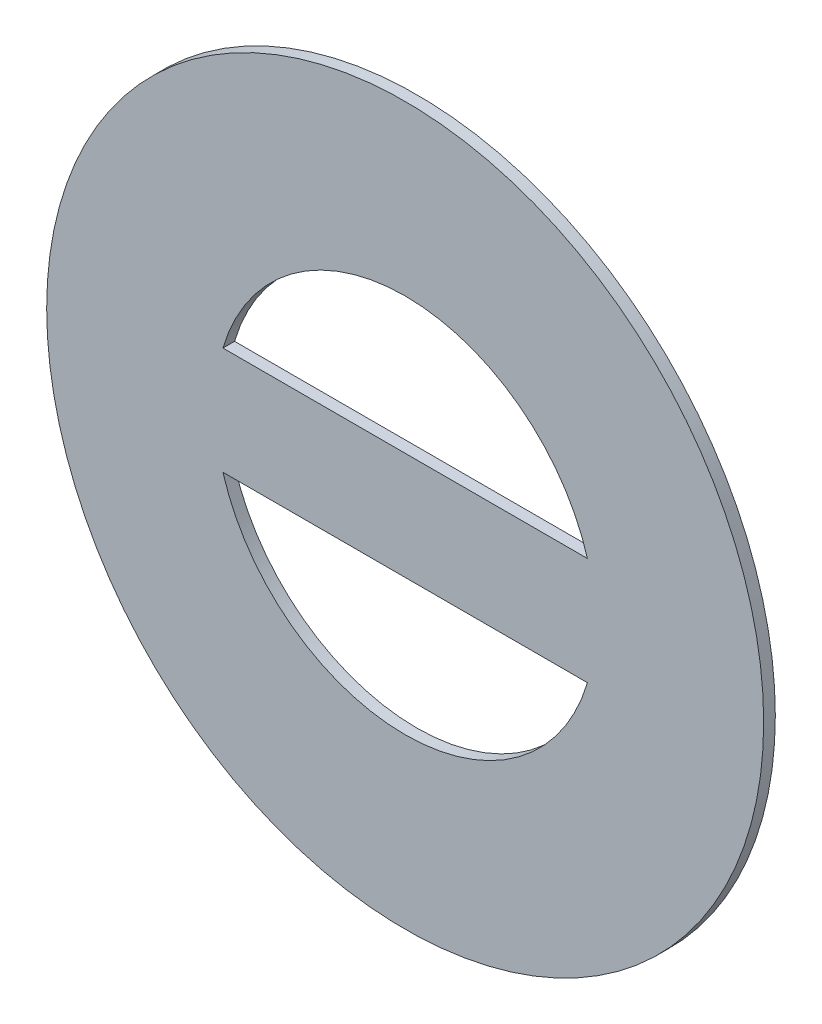
ISO-10303-21;
HEADER;
FILE_DESCRIPTION(('STEP AP214'),'2;1');
FILE_NAME('part.step','',(''),(''),'','','');
FILE_SCHEMA(('AUTOMOTIVE_DESIGN { 1 0 10303 214 1 1 1 1 }'));
ENDSEC;
DATA;
#1=APPLICATION_CONTEXT('core data for automotive mechanical design processes');
#2=APPLICATION_PROTOCOL_DEFINITION('international standard','automotive_design',2000,#1);
#3=PRODUCT_CONTEXT('',#1,'mechanical');
#4=PRODUCT('Part','Part','',(#3));
#5=PRODUCT_RELATED_PRODUCT_CATEGORY('part','',(#4));
#6=PRODUCT_DEFINITION_FORMATION('','',#4);
#7=PRODUCT_DEFINITION_CONTEXT('part definition',#1,'design');
#8=PRODUCT_DEFINITION('design','',#6,#7);
#9=PRODUCT_DEFINITION_SHAPE('','',#8);
#10=(LENGTH_UNIT() NAMED_UNIT(*) SI_UNIT(.MILLI.,.METRE.));
#11=(NAMED_UNIT(*) PLANE_ANGLE_UNIT() SI_UNIT($,.RADIAN.));
#12=(NAMED_UNIT(*) SI_UNIT($,.STERADIAN.) SOLID_ANGLE_UNIT());
#13=UNCERTAINTY_MEASURE_WITH_UNIT(LENGTH_MEASURE(1.E-05),#10,'distance_accuracy_value','');
#14=(GEOMETRIC_REPRESENTATION_CONTEXT(3) GLOBAL_UNCERTAINTY_ASSIGNED_CONTEXT((#13)) GLOBAL_UNIT_ASSIGNED_CONTEXT((#10,
#11,#12)) REPRESENTATION_CONTEXT('',''));
#15=CARTESIAN_POINT('',(0.,0.,0.));
#16=DIRECTION('',(0.,0.,1.));
#17=DIRECTION('',(1.,0.,0.));
#18=AXIS2_PLACEMENT_3D('',#15,#16,#17);
#19=CARTESIAN_POINT('',(4.87072486134823,-16.6967588105672,3.25));
#20=DIRECTION('',(0.,1.,0.));
#21=DIRECTION('',(0.,0.,1.));
#22=AXIS2_PLACEMENT_3D('',#19,#20,#21);
#23=PLANE('',#22);
#24=DIRECTION('',(1.,0.,0.));
#25=VECTOR('',#24,1.);
#26=CARTESIAN_POINT('',(4.87072486134823,-16.6967588105672,0.));
#27=LINE('',#26,#25);
#28=CARTESIAN_POINT('',(-45.9623352472071,-16.6967588105672,0.));
#29=VERTEX_POINT('',#28);
#30=CARTESIAN_POINT('',(55.7037849699036,-16.6967588105672,0.));
#31=VERTEX_POINT('',#30);
#32=EDGE_CURVE('E109',#29,#31,#27,.T.);
#33=ORIENTED_EDGE('',*,*,#32,.T.);
#34=DIRECTION('',(0.,0.,-1.));
#35=VECTOR('',#34,1.);
#36=CARTESIAN_POINT('',(55.7037849699036,-16.6967588105672,3.25));
#37=LINE('',#36,#35);
#38=CARTESIAN_POINT('',(55.7037849699036,-16.6967588105672,3.25));
#39=VERTEX_POINT('',#38);
#40=EDGE_CURVE('E11',#39,#31,#37,.T.);
#41=ORIENTED_EDGE('',*,*,#40,.F.);
#42=DIRECTION('',(1.,0.,0.));
#43=VECTOR('',#42,1.);
#44=CARTESIAN_POINT('',(4.87072486134823,-16.6967588105672,3.25));
#45=LINE('',#44,#43);
#46=CARTESIAN_POINT('',(-45.9623352472071,-16.6967588105672,3.25));
#47=VERTEX_POINT('',#46);
#48=EDGE_CURVE('E98',#47,#39,#45,.T.);
#49=ORIENTED_EDGE('',*,*,#48,.F.);
#50=DIRECTION('',(0.,0.,-1.));
#51=VECTOR('',#50,1.);
#52=CARTESIAN_POINT('',(-45.9623352472071,-16.6967588105672,3.25));
#53=LINE('',#52,#51);
#54=EDGE_CURVE('E45',#47,#29,#53,.T.);
#55=ORIENTED_EDGE('',*,*,#54,.T.);
#56=EDGE_LOOP('',(#33,#41,#49,#55));
#57=FACE_BOUND('',#56,.T.);
#58=ADVANCED_FACE('F35',(#57),#23,.F.);
#59=CARTESIAN_POINT('',(4.87072486134821,-1.69675881056719,3.25));
#60=DIRECTION('',(0.,0.,-1.));
#61=DIRECTION('',(-1.,0.,0.));
#62=AXIS2_PLACEMENT_3D('',#59,#60,#61);
#63=CYLINDRICAL_SURFACE('',#62,53.);
#64=CARTESIAN_POINT('',(4.87072486134821,-1.69675881056719,0.));
#65=DIRECTION('',(0.,0.,1.));
#66=DIRECTION('',(1.,0.,0.));
#67=AXIS2_PLACEMENT_3D('',#64,#65,#66);
#68=CIRCLE('',#67,53.);
#69=CARTESIAN_POINT('',(55.7037849699036,13.3032411894328,0.));
#70=VERTEX_POINT('',#69);
#71=CARTESIAN_POINT('',(-45.9623352472071,13.3032411894328,0.));
#72=VERTEX_POINT('',#71);
#73=EDGE_CURVE('E103',#70,#72,#68,.T.);
#74=ORIENTED_EDGE('',*,*,#73,.F.);
#75=DIRECTION('',(0.,0.,-1.));
#76=VECTOR('',#75,1.);
#77=CARTESIAN_POINT('',(55.7037849699036,13.3032411894328,3.25));
#78=LINE('',#77,#76);
#79=CARTESIAN_POINT('',(55.7037849699036,13.3032411894328,3.25));
#80=VERTEX_POINT('',#79);
#81=EDGE_CURVE('E39',#80,#70,#78,.T.);
#82=ORIENTED_EDGE('',*,*,#81,.F.);
#83=CARTESIAN_POINT('',(4.87072486134821,-1.69675881056719,3.25));
#84=DIRECTION('',(0.,0.,1.));
#85=DIRECTION('',(1.,0.,0.));
#86=AXIS2_PLACEMENT_3D('',#83,#84,#85);
#87=CIRCLE('',#86,53.);
#88=CARTESIAN_POINT('',(-45.9623352472071,13.3032411894328,3.25));
#89=VERTEX_POINT('',#88);
#90=EDGE_CURVE('E89',#80,#89,#87,.T.);
#91=ORIENTED_EDGE('',*,*,#90,.T.);
#92=DIRECTION('',(0.,0.,-1.));
#93=VECTOR('',#92,1.);
#94=CARTESIAN_POINT('',(-45.9623352472071,13.3032411894328,3.25));
#95=LINE('',#94,#93);
#96=EDGE_CURVE('E81',#89,#72,#95,.T.);
#97=ORIENTED_EDGE('',*,*,#96,.T.);
#98=EDGE_LOOP('',(#74,#82,#91,#97));
#99=FACE_BOUND('',#98,.T.);
#100=ADVANCED_FACE('F37',(#99),#63,.F.);
#101=CARTESIAN_POINT('',(4.87072486134821,-1.69675881056719,3.25));
#102=DIRECTION('',(0.,0.,-1.));
#103=DIRECTION('',(-1.,0.,0.));
#104=AXIS2_PLACEMENT_3D('',#101,#102,#103);
#105=CYLINDRICAL_SURFACE('',#104,100.);
#106=CARTESIAN_POINT('',(4.87072486134821,-1.69675881056719,3.25));
#107=DIRECTION('',(0.,0.,1.));
#108=DIRECTION('',(1.,0.,0.));
#109=AXIS2_PLACEMENT_3D('',#106,#107,#108);
#110=CIRCLE('',#109,100.);
#111=CARTESIAN_POINT('',(-95.1292751386518,-1.69675881056719,3.25));
#112=VERTEX_POINT('',#111);
#113=EDGE_CURVE('E95',#112,#112,#110,.T.);
#114=CARTESIAN_POINT('',(4.87072486134821,-1.69675881056719,0.));
#115=DIRECTION('',(0.,0.,1.));
#116=DIRECTION('',(1.,0.,0.));
#117=AXIS2_PLACEMENT_3D('',#114,#115,#116);
#118=CIRCLE('',#117,100.);
#119=CARTESIAN_POINT('',(-95.1292751386518,-1.69675881056719,0.));
#120=VERTEX_POINT('',#119);
#121=EDGE_CURVE('E106',#120,#120,#118,.T.);
#122=CARTESIAN_POINT('',(-95.1292751386518,-1.69675881056719,3.25));
#123=CARTESIAN_POINT('',(-95.1292751386518,-1.69675881056719,3.21614583333333));
#124=CARTESIAN_POINT('',(-95.1292751386518,-1.69675881056719,3.18229166666667));
#125=CARTESIAN_POINT('',(-95.1292751386518,-1.69675881056719,3.11458333333333));
#126=CARTESIAN_POINT('',(-95.1292751386518,-1.69675881056719,3.08072916666667));
#127=CARTESIAN_POINT('',(-95.1292751386518,-1.69675881056719,3.01302083333333));
#128=CARTESIAN_POINT('',(-95.1292751386518,-1.69675881056719,2.97916666666667));
#129=CARTESIAN_POINT('',(-95.1292751386518,-1.69675881056719,2.91145833333333));
#130=CARTESIAN_POINT('',(-95.1292751386518,-1.69675881056719,2.87760416666667));
#131=CARTESIAN_POINT('',(-95.1292751386518,-1.69675881056719,2.80989583333333));
#132=CARTESIAN_POINT('',(-95.1292751386518,-1.69675881056719,2.77604166666667));
#133=CARTESIAN_POINT('',(-95.1292751386518,-1.69675881056719,2.70833333333333));
#134=CARTESIAN_POINT('',(-95.1292751386518,-1.69675881056719,2.67447916666667));
#135=CARTESIAN_POINT('',(-95.1292751386518,-1.69675881056719,2.60677083333333));
#136=CARTESIAN_POINT('',(-95.1292751386518,-1.69675881056719,2.57291666666667));
#137=CARTESIAN_POINT('',(-95.1292751386518,-1.69675881056719,2.50520833333333));
#138=CARTESIAN_POINT('',(-95.1292751386518,-1.69675881056719,2.47135416666667));
#139=CARTESIAN_POINT('',(-95.1292751386518,-1.69675881056719,2.40364583333333));
#140=CARTESIAN_POINT('',(-95.1292751386518,-1.69675881056719,2.36979166666667));
#141=CARTESIAN_POINT('',(-95.1292751386518,-1.69675881056719,2.30208333333333));
#142=CARTESIAN_POINT('',(-95.1292751386518,-1.69675881056719,2.26822916666667));
#143=CARTESIAN_POINT('',(-95.1292751386518,-1.69675881056719,2.20052083333333));
#144=CARTESIAN_POINT('',(-95.1292751386518,-1.69675881056719,2.16666666666667));
#145=CARTESIAN_POINT('',(-95.1292751386518,-1.69675881056719,2.09895833333333));
#146=CARTESIAN_POINT('',(-95.1292751386518,-1.69675881056719,2.06510416666667));
#147=CARTESIAN_POINT('',(-95.1292751386518,-1.69675881056719,1.99739583333333));
#148=CARTESIAN_POINT('',(-95.1292751386518,-1.69675881056719,1.96354166666667));
#149=CARTESIAN_POINT('',(-95.1292751386518,-1.69675881056719,1.89583333333333));
#150=CARTESIAN_POINT('',(-95.1292751386518,-1.69675881056719,1.86197916666667));
#151=CARTESIAN_POINT('',(-95.1292751386518,-1.69675881056719,1.79427083333333));
#152=CARTESIAN_POINT('',(-95.1292751386518,-1.69675881056719,1.76041666666667));
#153=CARTESIAN_POINT('',(-95.1292751386518,-1.69675881056719,1.69270833333333));
#154=CARTESIAN_POINT('',(-95.1292751386518,-1.69675881056719,1.65885416666667));
#155=CARTESIAN_POINT('',(-95.1292751386518,-1.69675881056719,1.59114583333333));
#156=CARTESIAN_POINT('',(-95.1292751386518,-1.69675881056719,1.55729166666667));
#157=CARTESIAN_POINT('',(-95.1292751386518,-1.69675881056719,1.48958333333333));
#158=CARTESIAN_POINT('',(-95.1292751386518,-1.69675881056719,1.45572916666667));
#159=CARTESIAN_POINT('',(-95.1292751386518,-1.69675881056719,1.38802083333333));
#160=CARTESIAN_POINT('',(-95.1292751386518,-1.69675881056719,1.35416666666667));
#161=CARTESIAN_POINT('',(-95.1292751386518,-1.69675881056719,1.28645833333333));
#162=CARTESIAN_POINT('',(-95.1292751386518,-1.69675881056719,1.25260416666667));
#163=CARTESIAN_POINT('',(-95.1292751386518,-1.69675881056719,1.18489583333333));
#164=CARTESIAN_POINT('',(-95.1292751386518,-1.69675881056719,1.15104166666667));
#165=CARTESIAN_POINT('',(-95.1292751386518,-1.69675881056719,1.08333333333333));
#166=CARTESIAN_POINT('',(-95.1292751386518,-1.69675881056719,1.04947916666667));
#167=CARTESIAN_POINT('',(-95.1292751386518,-1.69675881056719,0.981770833333333));
#168=CARTESIAN_POINT('',(-95.1292751386518,-1.69675881056719,0.947916666666667));
#169=CARTESIAN_POINT('',(-95.1292751386518,-1.69675881056719,0.880208333333333));
#170=CARTESIAN_POINT('',(-95.1292751386518,-1.69675881056719,0.846354166666667));
#171=CARTESIAN_POINT('',(-95.1292751386518,-1.69675881056719,0.778645833333333));
#172=CARTESIAN_POINT('',(-95.1292751386518,-1.69675881056719,0.744791666666667));
#173=CARTESIAN_POINT('',(-95.1292751386518,-1.69675881056719,0.677083333333333));
#174=CARTESIAN_POINT('',(-95.1292751386518,-1.69675881056719,0.643229166666667));
#175=CARTESIAN_POINT('',(-95.1292751386518,-1.69675881056719,0.575520833333333));
#176=CARTESIAN_POINT('',(-95.1292751386518,-1.69675881056719,0.541666666666667));
#177=CARTESIAN_POINT('',(-95.1292751386518,-1.69675881056719,0.473958333333333));
#178=CARTESIAN_POINT('',(-95.1292751386518,-1.69675881056719,0.440104166666667));
#179=CARTESIAN_POINT('',(-95.1292751386518,-1.69675881056719,0.372395833333333));
#180=CARTESIAN_POINT('',(-95.1292751386518,-1.69675881056719,0.338541666666667));
#181=CARTESIAN_POINT('',(-95.1292751386518,-1.69675881056719,0.270833333333333));
#182=CARTESIAN_POINT('',(-95.1292751386518,-1.69675881056719,0.236979166666667));
#183=CARTESIAN_POINT('',(-95.1292751386518,-1.69675881056719,0.169270833333333));
#184=CARTESIAN_POINT('',(-95.1292751386518,-1.69675881056719,0.135416666666667));
#185=CARTESIAN_POINT('',(-95.1292751386518,-1.69675881056719,0.0677083333333334));
#186=CARTESIAN_POINT('',(-95.1292751386518,-1.69675881056719,0.0338541666666667));
#187=CARTESIAN_POINT('',(-95.1292751386518,-1.69675881056719,0.));
#188=B_SPLINE_CURVE_WITH_KNOTS('',3,(#122,#123,#124,#125,#126,#127,#128,#129,#130,#131,#132,
#133,#134,#135,#136,#137,#138,#139,#140,#141,#142,#143,#144,#145,#146,#147,#148,#149,#150,#151,
#152,#153,#154,#155,#156,#157,#158,#159,#160,#161,#162,#163,#164,#165,#166,#167,#168,#169,#170,
#171,#172,#173,#174,#175,#176,#177,#178,#179,#180,#181,#182,#183,#184,#185,#186,#187),
.UNSPECIFIED.,.F.,.F.,(4,2,2,2,2,2,2,2,2,2,2,2,2,2,2,2,2,2,2,2,2,2,2,2,2,2,2,2,2,2,2,2,4),(0.,
0.1015625,0.203125,0.3046875,0.40625,0.5078125,0.609375,0.7109375,0.8125,0.9140625,1.015625,
1.1171875,1.21875,1.3203125,1.421875,1.5234375,1.625,1.7265625,1.828125,1.9296875,2.03125,
2.1328125,2.234375,2.3359375,2.4375,2.5390625,2.640625,2.7421875,2.84375,2.9453125,3.046875,
3.1484375,3.25),.UNSPECIFIED.);
#189=EDGE_CURVE('BSEAM128',#112,#120,#188,.T.);
#190=ORIENTED_EDGE('',*,*,#113,.F.);
#191=ORIENTED_EDGE('',*,*,#121,.T.);
#192=ORIENTED_EDGE('',*,*,#189,.T.);
#193=ORIENTED_EDGE('',*,*,#189,.F.);
#194=EDGE_LOOP('',(#190,#192,#191,#193));
#195=FACE_BOUND('',#194,.T.);
#196=ADVANCED_FACE('F128',(#195),#105,.T.);
#197=CARTESIAN_POINT('',(4.87072486134823,13.3032411894328,3.25));
#198=DIRECTION('',(0.,1.,0.));
#199=DIRECTION('',(0.,0.,1.));
#200=AXIS2_PLACEMENT_3D('',#197,#198,#199);
#201=PLANE('',#200);
#202=DIRECTION('',(1.,0.,0.));
#203=VECTOR('',#202,1.);
#204=CARTESIAN_POINT('',(4.87072486134823,13.3032411894328,0.));
#205=LINE('',#204,#203);
#206=EDGE_CURVE('E86',#72,#70,#205,.T.);
#207=ORIENTED_EDGE('',*,*,#206,.F.);
#208=ORIENTED_EDGE('',*,*,#96,.F.);
#209=DIRECTION('',(1.,0.,0.));
#210=VECTOR('',#209,1.);
#211=CARTESIAN_POINT('',(4.87072486134823,13.3032411894328,3.25));
#212=LINE('',#211,#210);
#213=EDGE_CURVE('E84',#89,#80,#212,.T.);
#214=ORIENTED_EDGE('',*,*,#213,.T.);
#215=ORIENTED_EDGE('',*,*,#81,.T.);
#216=EDGE_LOOP('',(#207,#208,#214,#215));
#217=FACE_BOUND('',#216,.T.);
#218=ADVANCED_FACE('F82',(#217),#201,.T.);
#219=CARTESIAN_POINT('',(4.87072486134821,-1.69675881056719,3.25));
#220=DIRECTION('',(0.,0.,-1.));
#221=DIRECTION('',(-1.,0.,0.));
#222=AXIS2_PLACEMENT_3D('',#219,#220,#221);
#223=CYLINDRICAL_SURFACE('',#222,53.);
#224=CARTESIAN_POINT('',(4.87072486134821,-1.69675881056719,0.));
#225=DIRECTION('',(0.,0.,1.));
#226=DIRECTION('',(1.,0.,0.));
#227=AXIS2_PLACEMENT_3D('',#224,#225,#226);
#228=CIRCLE('',#227,53.);
#229=EDGE_CURVE('E91',#29,#31,#228,.T.);
#230=ORIENTED_EDGE('',*,*,#229,.F.);
#231=ORIENTED_EDGE('',*,*,#54,.F.);
#232=CARTESIAN_POINT('',(4.87072486134821,-1.69675881056719,3.25));
#233=DIRECTION('',(0.,0.,1.));
#234=DIRECTION('',(1.,0.,0.));
#235=AXIS2_PLACEMENT_3D('',#232,#233,#234);
#236=CIRCLE('',#235,53.);
#237=EDGE_CURVE('E88',#47,#39,#236,.T.);
#238=ORIENTED_EDGE('',*,*,#237,.T.);
#239=ORIENTED_EDGE('',*,*,#40,.T.);
#240=EDGE_LOOP('',(#230,#231,#238,#239));
#241=FACE_BOUND('',#240,.T.);
#242=ADVANCED_FACE('F120',(#241),#223,.F.);
#243=CARTESIAN_POINT('',(4.87072486134823,-221.838180166805,3.25));
#244=DIRECTION('',(0.,0.,1.));
#245=DIRECTION('',(1.,0.,0.));
#246=AXIS2_PLACEMENT_3D('',#243,#244,#245);
#247=PLANE('',#246);
#248=ORIENTED_EDGE('',*,*,#90,.F.);
#249=ORIENTED_EDGE('',*,*,#213,.F.);
#250=EDGE_LOOP('',(#248,#249));
#251=FACE_BOUND('',#250,.T.);
#252=ORIENTED_EDGE('',*,*,#113,.T.);
#253=EDGE_LOOP('',(#252));
#254=FACE_BOUND('',#253,.T.);
#255=ORIENTED_EDGE('',*,*,#48,.T.);
#256=ORIENTED_EDGE('',*,*,#237,.F.);
#257=EDGE_LOOP('',(#255,#256));
#258=FACE_BOUND('',#257,.T.);
#259=ADVANCED_FACE('F93',(#251,#254,#258),#247,.T.);
#260=CARTESIAN_POINT('',(4.87072486134823,-221.838180166805,0.));
#261=DIRECTION('',(0.,0.,1.));
#262=DIRECTION('',(1.,0.,0.));
#263=AXIS2_PLACEMENT_3D('',#260,#261,#262);
#264=PLANE('',#263);
#265=ORIENTED_EDGE('',*,*,#73,.T.);
#266=ORIENTED_EDGE('',*,*,#206,.T.);
#267=EDGE_LOOP('',(#265,#266));
#268=FACE_BOUND('',#267,.T.);
#269=ORIENTED_EDGE('',*,*,#121,.F.);
#270=EDGE_LOOP('',(#269));
#271=FACE_BOUND('',#270,.T.);
#272=ORIENTED_EDGE('',*,*,#32,.F.);
#273=ORIENTED_EDGE('',*,*,#229,.T.);
#274=EDGE_LOOP('',(#272,#273));
#275=FACE_BOUND('',#274,.T.);
#276=ADVANCED_FACE('F114',(#268,#271,#275),#264,.F.);
#277=CLOSED_SHELL('',(#58,#100,#196,#218,#242,#259,#276));
#278=MANIFOLD_SOLID_BREP('B2',#277);
#279=ADVANCED_BREP_SHAPE_REPRESENTATION('',(#18,#278),#14);
#280=SHAPE_DEFINITION_REPRESENTATION(#9,#279);
ENDSEC;
END-ISO-10303-21;
